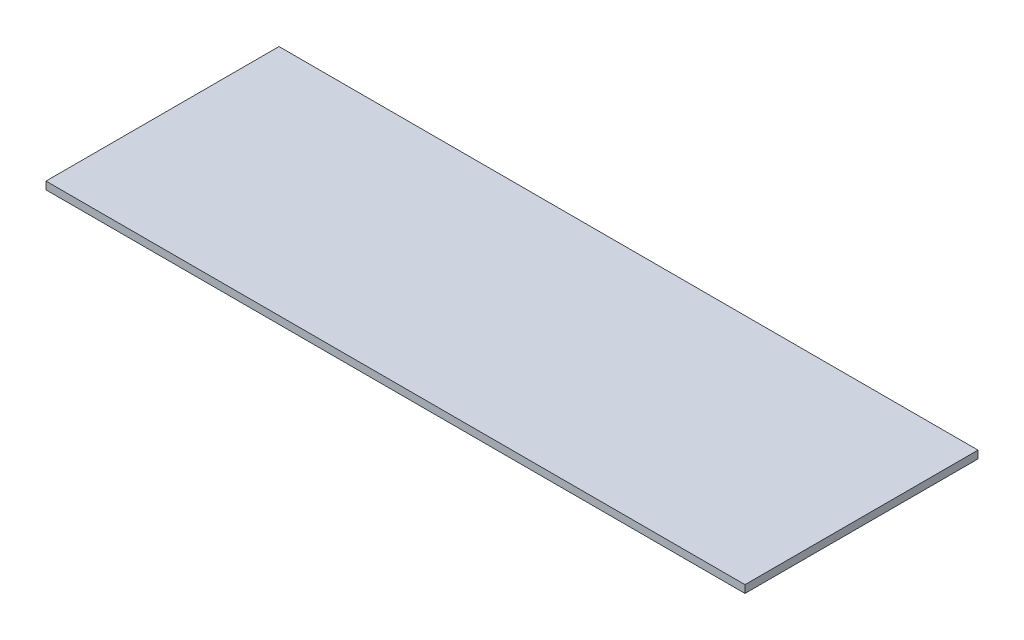
ISO-10303-21;
HEADER;
FILE_DESCRIPTION(('STEP AP214'),'2;1');
FILE_NAME('part.step','',(''),(''),'','','');
FILE_SCHEMA(('AUTOMOTIVE_DESIGN { 1 0 10303 214 1 1 1 1 }'));
ENDSEC;
DATA;
#1=APPLICATION_CONTEXT('core data for automotive mechanical design processes');
#2=APPLICATION_PROTOCOL_DEFINITION('international standard','automotive_design',2000,#1);
#3=PRODUCT_CONTEXT('',#1,'mechanical');
#4=PRODUCT('Part','Part','',(#3));
#5=PRODUCT_RELATED_PRODUCT_CATEGORY('part','',(#4));
#6=PRODUCT_DEFINITION_FORMATION('','',#4);
#7=PRODUCT_DEFINITION_CONTEXT('part definition',#1,'design');
#8=PRODUCT_DEFINITION('design','',#6,#7);
#9=PRODUCT_DEFINITION_SHAPE('','',#8);
#10=(LENGTH_UNIT() NAMED_UNIT(*) SI_UNIT(.MILLI.,.METRE.));
#11=(NAMED_UNIT(*) PLANE_ANGLE_UNIT() SI_UNIT($,.RADIAN.));
#12=(NAMED_UNIT(*) SI_UNIT($,.STERADIAN.) SOLID_ANGLE_UNIT());
#13=UNCERTAINTY_MEASURE_WITH_UNIT(LENGTH_MEASURE(1.E-05),#10,'distance_accuracy_value','');
#14=(GEOMETRIC_REPRESENTATION_CONTEXT(3) GLOBAL_UNCERTAINTY_ASSIGNED_CONTEXT((#13)) GLOBAL_UNIT_ASSIGNED_CONTEXT((#10,
#11,#12)) REPRESENTATION_CONTEXT('',''));
#15=CARTESIAN_POINT('',(0.,0.,0.));
#16=DIRECTION('',(0.,0.,1.));
#17=DIRECTION('',(1.,0.,0.));
#18=AXIS2_PLACEMENT_3D('',#15,#16,#17);
#19=CARTESIAN_POINT('',(457.2,10.,-152.4));
#20=DIRECTION('',(-1.,0.,0.));
#21=DIRECTION('',(0.,0.,1.));
#22=AXIS2_PLACEMENT_3D('',#19,#20,#21);
#23=PLANE('',#22);
#24=DIRECTION('',(0.,0.,-1.));
#25=VECTOR('',#24,1.);
#26=CARTESIAN_POINT('',(457.2,0.,-152.4));
#27=LINE('',#26,#25);
#28=CARTESIAN_POINT('',(457.2,0.,152.4));
#29=VERTEX_POINT('',#28);
#30=CARTESIAN_POINT('',(457.2,0.,-152.4));
#31=VERTEX_POINT('',#30);
#32=EDGE_CURVE('E96',#29,#31,#27,.T.);
#33=ORIENTED_EDGE('',*,*,#32,.T.);
#34=DIRECTION('',(0.,-1.,0.));
#35=VECTOR('',#34,1.);
#36=CARTESIAN_POINT('',(457.2,10.,-152.4));
#37=LINE('',#36,#35);
#38=CARTESIAN_POINT('',(457.2,10.,-152.4));
#39=VERTEX_POINT('',#38);
#40=EDGE_CURVE('E11',#39,#31,#37,.T.);
#41=ORIENTED_EDGE('',*,*,#40,.F.);
#42=DIRECTION('',(0.,0.,-1.));
#43=VECTOR('',#42,1.);
#44=CARTESIAN_POINT('',(457.2,10.,-152.4));
#45=LINE('',#44,#43);
#46=CARTESIAN_POINT('',(457.2,10.,152.4));
#47=VERTEX_POINT('',#46);
#48=EDGE_CURVE('E84',#47,#39,#45,.T.);
#49=ORIENTED_EDGE('',*,*,#48,.F.);
#50=DIRECTION('',(0.,-1.,0.));
#51=VECTOR('',#50,1.);
#52=CARTESIAN_POINT('',(457.2,10.,152.4));
#53=LINE('',#52,#51);
#54=EDGE_CURVE('E92',#47,#29,#53,.T.);
#55=ORIENTED_EDGE('',*,*,#54,.T.);
#56=EDGE_LOOP('',(#33,#41,#49,#55));
#57=FACE_BOUND('',#56,.T.);
#58=ADVANCED_FACE('F33',(#57),#23,.F.);
#59=CARTESIAN_POINT('',(-457.2,10.,-152.4));
#60=DIRECTION('',(0.,0.,1.));
#61=DIRECTION('',(1.,0.,0.));
#62=AXIS2_PLACEMENT_3D('',#59,#60,#61);
#63=PLANE('',#62);
#64=DIRECTION('',(-1.,0.,0.));
#65=VECTOR('',#64,1.);
#66=CARTESIAN_POINT('',(-457.2,0.,-152.4));
#67=LINE('',#66,#65);
#68=CARTESIAN_POINT('',(-457.2,0.,-152.4));
#69=VERTEX_POINT('',#68);
#70=EDGE_CURVE('E88',#31,#69,#67,.T.);
#71=ORIENTED_EDGE('',*,*,#70,.T.);
#72=DIRECTION('',(0.,-1.,0.));
#73=VECTOR('',#72,1.);
#74=CARTESIAN_POINT('',(-457.2,10.,-152.4));
#75=LINE('',#74,#73);
#76=CARTESIAN_POINT('',(-457.2,10.,-152.4));
#77=VERTEX_POINT('',#76);
#78=EDGE_CURVE('E41',#77,#69,#75,.T.);
#79=ORIENTED_EDGE('',*,*,#78,.F.);
#80=DIRECTION('',(-1.,0.,0.));
#81=VECTOR('',#80,1.);
#82=CARTESIAN_POINT('',(-457.2,10.,-152.4));
#83=LINE('',#82,#81);
#84=EDGE_CURVE('E79',#39,#77,#83,.T.);
#85=ORIENTED_EDGE('',*,*,#84,.F.);
#86=ORIENTED_EDGE('',*,*,#40,.T.);
#87=EDGE_LOOP('',(#71,#79,#85,#86));
#88=FACE_BOUND('',#87,.T.);
#89=ADVANCED_FACE('F87',(#88),#63,.F.);
#90=CARTESIAN_POINT('',(-457.2,10.,-152.4));
#91=DIRECTION('',(1.,0.,0.));
#92=DIRECTION('',(0.,0.,-1.));
#93=AXIS2_PLACEMENT_3D('',#90,#91,#92);
#94=PLANE('',#93);
#95=DIRECTION('',(0.,0.,1.));
#96=VECTOR('',#95,1.);
#97=CARTESIAN_POINT('',(-457.2,0.,-152.4));
#98=LINE('',#97,#96);
#99=CARTESIAN_POINT('',(-457.2,0.,152.4));
#100=VERTEX_POINT('',#99);
#101=EDGE_CURVE('E66',#69,#100,#98,.T.);
#102=ORIENTED_EDGE('',*,*,#101,.T.);
#103=DIRECTION('',(0.,-1.,0.));
#104=VECTOR('',#103,1.);
#105=CARTESIAN_POINT('',(-457.2,10.,152.4));
#106=LINE('',#105,#104);
#107=CARTESIAN_POINT('',(-457.2,10.,152.4));
#108=VERTEX_POINT('',#107);
#109=EDGE_CURVE('E89',#108,#100,#106,.T.);
#110=ORIENTED_EDGE('',*,*,#109,.F.);
#111=DIRECTION('',(0.,0.,1.));
#112=VECTOR('',#111,1.);
#113=CARTESIAN_POINT('',(-457.2,10.,-152.4));
#114=LINE('',#113,#112);
#115=EDGE_CURVE('E82',#77,#108,#114,.T.);
#116=ORIENTED_EDGE('',*,*,#115,.F.);
#117=ORIENTED_EDGE('',*,*,#78,.T.);
#118=EDGE_LOOP('',(#102,#110,#116,#117));
#119=FACE_BOUND('',#118,.T.);
#120=ADVANCED_FACE('F90',(#119),#94,.F.);
#121=CARTESIAN_POINT('',(-457.2,10.,152.4));
#122=DIRECTION('',(0.,0.,-1.));
#123=DIRECTION('',(-1.,0.,0.));
#124=AXIS2_PLACEMENT_3D('',#121,#122,#123);
#125=PLANE('',#124);
#126=DIRECTION('',(1.,0.,0.));
#127=VECTOR('',#126,1.);
#128=CARTESIAN_POINT('',(-457.2,0.,152.4));
#129=LINE('',#128,#127);
#130=EDGE_CURVE('E72',#100,#29,#129,.T.);
#131=ORIENTED_EDGE('',*,*,#130,.T.);
#132=ORIENTED_EDGE('',*,*,#54,.F.);
#133=DIRECTION('',(1.,0.,0.));
#134=VECTOR('',#133,1.);
#135=CARTESIAN_POINT('',(-457.2,10.,152.4));
#136=LINE('',#135,#134);
#137=EDGE_CURVE('E49',#108,#47,#136,.T.);
#138=ORIENTED_EDGE('',*,*,#137,.F.);
#139=ORIENTED_EDGE('',*,*,#109,.T.);
#140=EDGE_LOOP('',(#131,#132,#138,#139));
#141=FACE_BOUND('',#140,.T.);
#142=ADVANCED_FACE('F103',(#141),#125,.F.);
#143=CARTESIAN_POINT('',(0.,10.,0.));
#144=DIRECTION('',(0.,1.,0.));
#145=DIRECTION('',(0.,0.,1.));
#146=AXIS2_PLACEMENT_3D('',#143,#144,#145);
#147=PLANE('',#146);
#148=ORIENTED_EDGE('',*,*,#48,.T.);
#149=ORIENTED_EDGE('',*,*,#84,.T.);
#150=ORIENTED_EDGE('',*,*,#115,.T.);
#151=ORIENTED_EDGE('',*,*,#137,.T.);
#152=EDGE_LOOP('',(#148,#149,#150,#151));
#153=FACE_BOUND('',#152,.T.);
#154=ADVANCED_FACE('F80',(#153),#147,.T.);
#155=CARTESIAN_POINT('',(0.,0.,0.));
#156=DIRECTION('',(0.,1.,0.));
#157=DIRECTION('',(0.,0.,1.));
#158=AXIS2_PLACEMENT_3D('',#155,#156,#157);
#159=PLANE('',#158);
#160=ORIENTED_EDGE('',*,*,#32,.F.);
#161=ORIENTED_EDGE('',*,*,#130,.F.);
#162=ORIENTED_EDGE('',*,*,#101,.F.);
#163=ORIENTED_EDGE('',*,*,#70,.F.);
#164=EDGE_LOOP('',(#160,#161,#162,#163));
#165=FACE_BOUND('',#164,.T.);
#166=ADVANCED_FACE('F106',(#165),#159,.F.);
#167=CLOSED_SHELL('',(#58,#89,#120,#142,#154,#166));
#168=MANIFOLD_SOLID_BREP('B2',#167);
#169=ADVANCED_BREP_SHAPE_REPRESENTATION('',(#18,#168),#14);
#170=SHAPE_DEFINITION_REPRESENTATION(#9,#169);
ENDSEC;
END-ISO-10303-21;
